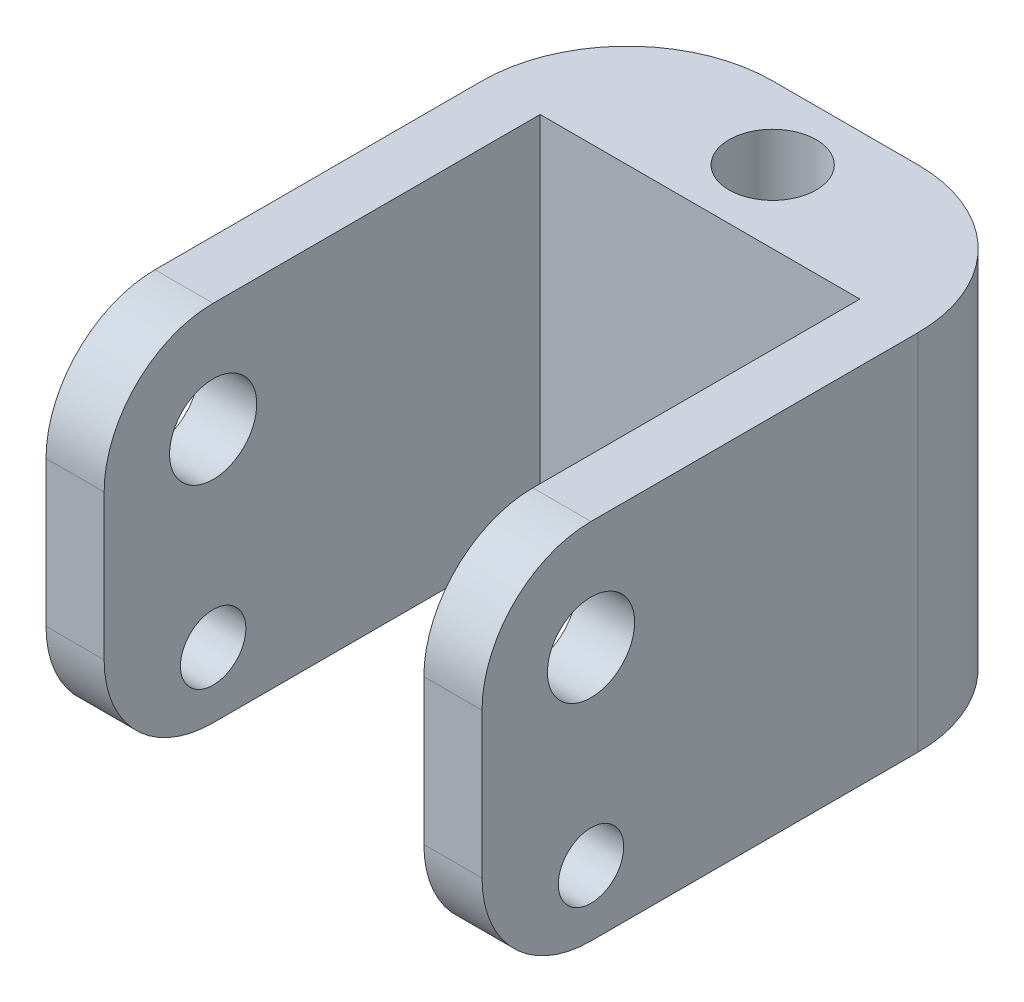
ISO-10303-21;
HEADER;
FILE_DESCRIPTION(('STEP AP214'),'2;1');
FILE_NAME('part.step','',(''),(''),'','','');
FILE_SCHEMA(('AUTOMOTIVE_DESIGN { 1 0 10303 214 1 1 1 1 }'));
ENDSEC;
DATA;
#1=APPLICATION_CONTEXT('core data for automotive mechanical design processes');
#2=APPLICATION_PROTOCOL_DEFINITION('international standard','automotive_design',2000,#1);
#3=PRODUCT_CONTEXT('',#1,'mechanical');
#4=PRODUCT('Part','Part','',(#3));
#5=PRODUCT_RELATED_PRODUCT_CATEGORY('part','',(#4));
#6=PRODUCT_DEFINITION_FORMATION('','',#4);
#7=PRODUCT_DEFINITION_CONTEXT('part definition',#1,'design');
#8=PRODUCT_DEFINITION('design','',#6,#7);
#9=PRODUCT_DEFINITION_SHAPE('','',#8);
#10=(LENGTH_UNIT() NAMED_UNIT(*) SI_UNIT(.MILLI.,.METRE.));
#11=(NAMED_UNIT(*) PLANE_ANGLE_UNIT() SI_UNIT($,.RADIAN.));
#12=(NAMED_UNIT(*) SI_UNIT($,.STERADIAN.) SOLID_ANGLE_UNIT());
#13=UNCERTAINTY_MEASURE_WITH_UNIT(LENGTH_MEASURE(1.E-05),#10,'distance_accuracy_value','');
#14=(GEOMETRIC_REPRESENTATION_CONTEXT(3) GLOBAL_UNCERTAINTY_ASSIGNED_CONTEXT((#13)) GLOBAL_UNIT_ASSIGNED_CONTEXT((#10,
#11,#12)) REPRESENTATION_CONTEXT('',''));
#15=CARTESIAN_POINT('',(0.,0.,0.));
#16=DIRECTION('',(0.,0.,1.));
#17=DIRECTION('',(1.,0.,0.));
#18=AXIS2_PLACEMENT_3D('',#15,#16,#17);
#19=CARTESIAN_POINT('',(30.,-25.,40.));
#20=DIRECTION('',(0.,0.,-1.));
#21=DIRECTION('',(-1.,0.,0.));
#22=AXIS2_PLACEMENT_3D('',#19,#20,#21);
#23=PLANE('',#22);
#24=DIRECTION('',(0.,1.,0.));
#25=VECTOR('',#24,1.);
#26=CARTESIAN_POINT('',(-22.,-25.,40.));
#27=LINE('',#26,#25);
#28=CARTESIAN_POINT('',(-22.,-10.,40.));
#29=VERTEX_POINT('',#28);
#30=CARTESIAN_POINT('',(-22.,10.,40.));
#31=VERTEX_POINT('',#30);
#32=EDGE_CURVE('E175',#29,#31,#27,.T.);
#33=ORIENTED_EDGE('',*,*,#32,.T.);
#34=DIRECTION('',(-1.,0.,0.));
#35=VECTOR('',#34,1.);
#36=CARTESIAN_POINT('',(30.,10.,40.));
#37=LINE('',#36,#35);
#38=CARTESIAN_POINT('',(-30.,10.,40.));
#39=VERTEX_POINT('',#38);
#40=EDGE_CURVE('E245',#31,#39,#37,.T.);
#41=ORIENTED_EDGE('',*,*,#40,.T.);
#42=DIRECTION('',(0.,-1.,0.));
#43=VECTOR('',#42,1.);
#44=CARTESIAN_POINT('',(-30.,-25.,40.));
#45=LINE('',#44,#43);
#46=CARTESIAN_POINT('',(-30.,-10.,40.));
#47=VERTEX_POINT('',#46);
#48=EDGE_CURVE('E210',#39,#47,#45,.T.);
#49=ORIENTED_EDGE('',*,*,#48,.T.);
#50=DIRECTION('',(-1.,0.,0.));
#51=VECTOR('',#50,1.);
#52=CARTESIAN_POINT('',(30.,-10.,40.));
#53=LINE('',#52,#51);
#54=EDGE_CURVE('E243',#47,#29,#53,.F.);
#55=ORIENTED_EDGE('',*,*,#54,.T.);
#56=EDGE_LOOP('',(#33,#41,#49,#55));
#57=FACE_BOUND('',#56,.T.);
#58=ADVANCED_FACE('F39',(#57),#23,.F.);
#59=CARTESIAN_POINT('',(30.,10.,25.));
#60=DIRECTION('',(-1.,0.,0.));
#61=DIRECTION('',(0.,0.,1.));
#62=AXIS2_PLACEMENT_3D('',#59,#60,#61);
#63=CYLINDRICAL_SURFACE('',#62,6.);
#64=CARTESIAN_POINT('',(-22.,10.,25.));
#65=DIRECTION('',(-1.,0.,0.));
#66=DIRECTION('',(0.,0.,1.));
#67=AXIS2_PLACEMENT_3D('',#64,#65,#66);
#68=CIRCLE('',#67,6.);
#69=CARTESIAN_POINT('',(-22.,10.,31.));
#70=VERTEX_POINT('',#69);
#71=EDGE_CURVE('E185',#70,#70,#68,.T.);
#72=ORIENTED_EDGE('',*,*,#71,.F.);
#73=EDGE_LOOP('',(#72));
#74=FACE_BOUND('',#73,.T.);
#75=CARTESIAN_POINT('',(-30.,10.,25.));
#76=DIRECTION('',(1.,0.,0.));
#77=DIRECTION('',(0.,0.,-1.));
#78=AXIS2_PLACEMENT_3D('',#75,#76,#77);
#79=CIRCLE('',#78,6.);
#80=CARTESIAN_POINT('',(-30.,10.,19.));
#81=VERTEX_POINT('',#80);
#82=EDGE_CURVE('E192',#81,#81,#79,.T.);
#83=ORIENTED_EDGE('',*,*,#82,.F.);
#84=EDGE_LOOP('',(#83));
#85=FACE_BOUND('',#84,.T.);
#86=ADVANCED_FACE('F296',(#74,#85),#63,.F.);
#87=CARTESIAN_POINT('',(30.,-16.,25.));
#88=DIRECTION('',(-1.,0.,0.));
#89=DIRECTION('',(0.,0.,1.));
#90=AXIS2_PLACEMENT_3D('',#87,#88,#89);
#91=CYLINDRICAL_SURFACE('',#90,4.5);
#92=CARTESIAN_POINT('',(-22.,-16.,25.));
#93=DIRECTION('',(-1.,0.,0.));
#94=DIRECTION('',(0.,0.,1.));
#95=AXIS2_PLACEMENT_3D('',#92,#93,#94);
#96=CIRCLE('',#95,4.5);
#97=CARTESIAN_POINT('',(-22.,-16.,29.5));
#98=VERTEX_POINT('',#97);
#99=EDGE_CURVE('E184',#98,#98,#96,.T.);
#100=ORIENTED_EDGE('',*,*,#99,.F.);
#101=EDGE_LOOP('',(#100));
#102=FACE_BOUND('',#101,.T.);
#103=CARTESIAN_POINT('',(-30.,-16.,25.));
#104=DIRECTION('',(1.,0.,0.));
#105=DIRECTION('',(0.,0.,-1.));
#106=AXIS2_PLACEMENT_3D('',#103,#104,#105);
#107=CIRCLE('',#106,4.5);
#108=CARTESIAN_POINT('',(-30.,-16.,20.5));
#109=VERTEX_POINT('',#108);
#110=EDGE_CURVE('E188',#109,#109,#107,.T.);
#111=ORIENTED_EDGE('',*,*,#110,.F.);
#112=EDGE_LOOP('',(#111));
#113=FACE_BOUND('',#112,.T.);
#114=ADVANCED_FACE('F304',(#102,#113),#91,.F.);
#115=CARTESIAN_POINT('',(30.,0.,0.));
#116=DIRECTION('',(-1.,0.,0.));
#117=DIRECTION('',(0.,0.,1.));
#118=AXIS2_PLACEMENT_3D('',#115,#116,#117);
#119=PLANE('',#118);
#120=DIRECTION('',(0.,-1.,0.));
#121=VECTOR('',#120,1.);
#122=CARTESIAN_POINT('',(30.,-25.,40.));
#123=LINE('',#122,#121);
#124=CARTESIAN_POINT('',(30.,10.,40.));
#125=VERTEX_POINT('',#124);
#126=CARTESIAN_POINT('',(30.,-10.,40.));
#127=VERTEX_POINT('',#126);
#128=EDGE_CURVE('E203',#125,#127,#123,.T.);
#129=ORIENTED_EDGE('',*,*,#128,.T.);
#130=CARTESIAN_POINT('',(30.,-10.,25.));
#131=DIRECTION('',(-1.,0.,0.));
#132=DIRECTION('',(0.,0.,1.));
#133=AXIS2_PLACEMENT_3D('',#130,#131,#132);
#134=CIRCLE('',#133,15.);
#135=CARTESIAN_POINT('',(30.,-25.,25.));
#136=VERTEX_POINT('',#135);
#137=EDGE_CURVE('E11',#127,#136,#134,.F.);
#138=ORIENTED_EDGE('',*,*,#137,.T.);
#139=DIRECTION('',(0.,0.,-1.));
#140=VECTOR('',#139,1.);
#141=CARTESIAN_POINT('',(30.,-25.,40.));
#142=LINE('',#141,#140);
#143=CARTESIAN_POINT('',(30.,-25.,-20.));
#144=VERTEX_POINT('',#143);
#145=EDGE_CURVE('E206',#136,#144,#142,.T.);
#146=ORIENTED_EDGE('',*,*,#145,.T.);
#147=DIRECTION('',(0.,1.,0.));
#148=VECTOR('',#147,1.);
#149=CARTESIAN_POINT('',(30.,0.,-20.));
#150=LINE('',#149,#148);
#151=CARTESIAN_POINT('',(30.,25.,-20.));
#152=VERTEX_POINT('',#151);
#153=EDGE_CURVE('E240',#144,#152,#150,.T.);
#154=ORIENTED_EDGE('',*,*,#153,.T.);
#155=DIRECTION('',(0.,0.,1.));
#156=VECTOR('',#155,1.);
#157=CARTESIAN_POINT('',(30.,25.,40.));
#158=LINE('',#157,#156);
#159=CARTESIAN_POINT('',(30.,25.,25.));
#160=VERTEX_POINT('',#159);
#161=EDGE_CURVE('E201',#152,#160,#158,.T.);
#162=ORIENTED_EDGE('',*,*,#161,.T.);
#163=CARTESIAN_POINT('',(30.,10.,25.));
#164=DIRECTION('',(-1.,0.,0.));
#165=DIRECTION('',(0.,0.,1.));
#166=AXIS2_PLACEMENT_3D('',#163,#164,#165);
#167=CIRCLE('',#166,15.);
#168=EDGE_CURVE('E47',#160,#125,#167,.F.);
#169=ORIENTED_EDGE('',*,*,#168,.T.);
#170=EDGE_LOOP('',(#129,#138,#146,#154,#162,#169));
#171=FACE_BOUND('',#170,.T.);
#172=CARTESIAN_POINT('',(30.,10.,25.));
#173=DIRECTION('',(1.,0.,0.));
#174=DIRECTION('',(0.,0.,-1.));
#175=AXIS2_PLACEMENT_3D('',#172,#173,#174);
#176=CIRCLE('',#175,6.);
#177=CARTESIAN_POINT('',(30.,10.,19.));
#178=VERTEX_POINT('',#177);
#179=EDGE_CURVE('E195',#178,#178,#176,.T.);
#180=ORIENTED_EDGE('',*,*,#179,.F.);
#181=EDGE_LOOP('',(#180));
#182=FACE_BOUND('',#181,.T.);
#183=CARTESIAN_POINT('',(30.,-16.,25.));
#184=DIRECTION('',(1.,0.,0.));
#185=DIRECTION('',(0.,0.,-1.));
#186=AXIS2_PLACEMENT_3D('',#183,#184,#185);
#187=CIRCLE('',#186,4.5);
#188=CARTESIAN_POINT('',(30.,-16.,20.5));
#189=VERTEX_POINT('',#188);
#190=EDGE_CURVE('E189',#189,#189,#187,.T.);
#191=ORIENTED_EDGE('',*,*,#190,.F.);
#192=EDGE_LOOP('',(#191));
#193=FACE_BOUND('',#192,.T.);
#194=ADVANCED_FACE('F285',(#171,#182,#193),#119,.F.);
#195=CARTESIAN_POINT('',(-30.,0.,0.));
#196=DIRECTION('',(-1.,0.,0.));
#197=DIRECTION('',(0.,0.,1.));
#198=AXIS2_PLACEMENT_3D('',#195,#196,#197);
#199=PLANE('',#198);
#200=ORIENTED_EDGE('',*,*,#82,.T.);
#201=EDGE_LOOP('',(#200));
#202=FACE_BOUND('',#201,.T.);
#203=ORIENTED_EDGE('',*,*,#48,.F.);
#204=CARTESIAN_POINT('',(-30.,10.,25.));
#205=DIRECTION('',(-1.,0.,0.));
#206=DIRECTION('',(0.,0.,1.));
#207=AXIS2_PLACEMENT_3D('',#204,#205,#206);
#208=CIRCLE('',#207,15.);
#209=CARTESIAN_POINT('',(-30.,25.,25.));
#210=VERTEX_POINT('',#209);
#211=EDGE_CURVE('E250',#39,#210,#208,.T.);
#212=ORIENTED_EDGE('',*,*,#211,.T.);
#213=DIRECTION('',(0.,0.,1.));
#214=VECTOR('',#213,1.);
#215=CARTESIAN_POINT('',(-30.,25.,40.));
#216=LINE('',#215,#214);
#217=CARTESIAN_POINT('',(-30.,25.,-20.));
#218=VERTEX_POINT('',#217);
#219=EDGE_CURVE('E198',#218,#210,#216,.T.);
#220=ORIENTED_EDGE('',*,*,#219,.F.);
#221=DIRECTION('',(0.,1.,0.));
#222=VECTOR('',#221,1.);
#223=CARTESIAN_POINT('',(-30.,-25.,-20.));
#224=LINE('',#223,#222);
#225=CARTESIAN_POINT('',(-30.,-25.,-20.));
#226=VERTEX_POINT('',#225);
#227=EDGE_CURVE('E232',#218,#226,#224,.F.);
#228=ORIENTED_EDGE('',*,*,#227,.T.);
#229=DIRECTION('',(0.,0.,-1.));
#230=VECTOR('',#229,1.);
#231=CARTESIAN_POINT('',(-30.,-25.,40.));
#232=LINE('',#231,#230);
#233=CARTESIAN_POINT('',(-30.,-25.,25.));
#234=VERTEX_POINT('',#233);
#235=EDGE_CURVE('E204',#234,#226,#232,.T.);
#236=ORIENTED_EDGE('',*,*,#235,.F.);
#237=CARTESIAN_POINT('',(-30.,-10.,25.));
#238=DIRECTION('',(-1.,0.,0.));
#239=DIRECTION('',(0.,0.,1.));
#240=AXIS2_PLACEMENT_3D('',#237,#238,#239);
#241=CIRCLE('',#240,15.);
#242=EDGE_CURVE('E248',#234,#47,#241,.T.);
#243=ORIENTED_EDGE('',*,*,#242,.T.);
#244=EDGE_LOOP('',(#203,#212,#220,#228,#236,#243));
#245=FACE_BOUND('',#244,.T.);
#246=ORIENTED_EDGE('',*,*,#110,.T.);
#247=EDGE_LOOP('',(#246));
#248=FACE_BOUND('',#247,.T.);
#249=ADVANCED_FACE('F322',(#202,#245,#248),#199,.T.);
#250=CARTESIAN_POINT('',(30.,-25.,-40.));
#251=DIRECTION('',(0.,0.,1.));
#252=DIRECTION('',(1.,0.,0.));
#253=AXIS2_PLACEMENT_3D('',#250,#251,#252);
#254=PLANE('',#253);
#255=DIRECTION('',(-1.,0.,0.));
#256=VECTOR('',#255,1.);
#257=CARTESIAN_POINT('',(30.,-25.,-40.));
#258=LINE('',#257,#256);
#259=CARTESIAN_POINT('',(10.,-25.,-40.));
#260=VERTEX_POINT('',#259);
#261=CARTESIAN_POINT('',(-9.99999999999999,-25.,-40.));
#262=VERTEX_POINT('',#261);
#263=EDGE_CURVE('E208',#260,#262,#258,.T.);
#264=ORIENTED_EDGE('',*,*,#263,.T.);
#265=DIRECTION('',(0.,1.,0.));
#266=VECTOR('',#265,1.);
#267=CARTESIAN_POINT('',(-9.99999999999999,25.,-40.));
#268=LINE('',#267,#266);
#269=CARTESIAN_POINT('',(-9.99999999999999,25.,-40.));
#270=VERTEX_POINT('',#269);
#271=EDGE_CURVE('E225',#262,#270,#268,.T.);
#272=ORIENTED_EDGE('',*,*,#271,.T.);
#273=DIRECTION('',(-1.,0.,0.));
#274=VECTOR('',#273,1.);
#275=CARTESIAN_POINT('',(30.,25.,-40.));
#276=LINE('',#275,#274);
#277=CARTESIAN_POINT('',(10.,25.,-40.));
#278=VERTEX_POINT('',#277);
#279=EDGE_CURVE('E216',#278,#270,#276,.T.);
#280=ORIENTED_EDGE('',*,*,#279,.F.);
#281=DIRECTION('',(0.,1.,0.));
#282=VECTOR('',#281,1.);
#283=CARTESIAN_POINT('',(10.,-25.,-40.));
#284=LINE('',#283,#282);
#285=EDGE_CURVE('E219',#278,#260,#284,.F.);
#286=ORIENTED_EDGE('',*,*,#285,.T.);
#287=EDGE_LOOP('',(#264,#272,#280,#286));
#288=FACE_BOUND('',#287,.T.);
#289=ADVANCED_FACE('F316',(#288),#254,.F.);
#290=CARTESIAN_POINT('',(30.,25.,40.));
#291=DIRECTION('',(0.,-1.,0.));
#292=DIRECTION('',(0.,0.,-1.));
#293=AXIS2_PLACEMENT_3D('',#290,#291,#292);
#294=PLANE('',#293);
#295=CARTESIAN_POINT('',(0.,25.,-30.));
#296=DIRECTION('',(0.,1.,0.));
#297=DIRECTION('',(0.,0.,1.));
#298=AXIS2_PLACEMENT_3D('',#295,#296,#297);
#299=CIRCLE('',#298,6.);
#300=CARTESIAN_POINT('',(0.,25.,-24.));
#301=VERTEX_POINT('',#300);
#302=EDGE_CURVE('E363',#301,#301,#299,.T.);
#303=ORIENTED_EDGE('',*,*,#302,.F.);
#304=EDGE_LOOP('',(#303));
#305=FACE_BOUND('',#304,.T.);
#306=ORIENTED_EDGE('',*,*,#219,.T.);
#307=DIRECTION('',(-1.,0.,0.));
#308=VECTOR('',#307,1.);
#309=CARTESIAN_POINT('',(30.,25.,25.));
#310=LINE('',#309,#308);
#311=CARTESIAN_POINT('',(-22.,25.,25.));
#312=VERTEX_POINT('',#311);
#313=EDGE_CURVE('E254',#210,#312,#310,.F.);
#314=ORIENTED_EDGE('',*,*,#313,.T.);
#315=DIRECTION('',(0.,0.,1.));
#316=VECTOR('',#315,1.);
#317=CARTESIAN_POINT('',(-22.,25.,40.));
#318=LINE('',#317,#316);
#319=CARTESIAN_POINT('',(-22.,25.,-20.));
#320=VERTEX_POINT('',#319);
#321=EDGE_CURVE('E151',#320,#312,#318,.T.);
#322=ORIENTED_EDGE('',*,*,#321,.F.);
#323=DIRECTION('',(-1.,0.,0.));
#324=VECTOR('',#323,1.);
#325=CARTESIAN_POINT('',(-22.,25.,-20.));
#326=LINE('',#325,#324);
#327=CARTESIAN_POINT('',(22.,25.,-20.));
#328=VERTEX_POINT('',#327);
#329=EDGE_CURVE('E150',#328,#320,#326,.T.);
#330=ORIENTED_EDGE('',*,*,#329,.F.);
#331=DIRECTION('',(0.,0.,-1.));
#332=VECTOR('',#331,1.);
#333=CARTESIAN_POINT('',(22.,25.,40.));
#334=LINE('',#333,#332);
#335=CARTESIAN_POINT('',(22.,25.,25.));
#336=VERTEX_POINT('',#335);
#337=EDGE_CURVE('E140',#336,#328,#334,.T.);
#338=ORIENTED_EDGE('',*,*,#337,.F.);
#339=DIRECTION('',(-1.,0.,0.));
#340=VECTOR('',#339,1.);
#341=CARTESIAN_POINT('',(30.,25.,25.));
#342=LINE('',#341,#340);
#343=EDGE_CURVE('E252',#336,#160,#342,.F.);
#344=ORIENTED_EDGE('',*,*,#343,.T.);
#345=ORIENTED_EDGE('',*,*,#161,.F.);
#346=CARTESIAN_POINT('',(10.,25.,-20.));
#347=DIRECTION('',(0.,-1.,0.));
#348=DIRECTION('',(0.,0.,-1.));
#349=AXIS2_PLACEMENT_3D('',#346,#347,#348);
#350=CIRCLE('',#349,20.);
#351=EDGE_CURVE('E228',#152,#278,#350,.F.);
#352=ORIENTED_EDGE('',*,*,#351,.T.);
#353=ORIENTED_EDGE('',*,*,#279,.T.);
#354=CARTESIAN_POINT('',(-9.99999999999999,25.,-20.));
#355=DIRECTION('',(0.,-1.,0.));
#356=DIRECTION('',(0.,0.,-1.));
#357=AXIS2_PLACEMENT_3D('',#354,#355,#356);
#358=CIRCLE('',#357,20.);
#359=EDGE_CURVE('E230',#270,#218,#358,.F.);
#360=ORIENTED_EDGE('',*,*,#359,.T.);
#361=EDGE_LOOP('',(#306,#314,#322,#330,#338,#344,#345,#352,#353,#360));
#362=FACE_BOUND('',#361,.T.);
#363=ADVANCED_FACE('F164',(#305,#362),#294,.F.);
#364=DIRECTION('',(0.,1.,0.));
#365=VECTOR('',#364,1.);
#366=CARTESIAN_POINT('',(22.,-25.,40.));
#367=LINE('',#366,#365);
#368=CARTESIAN_POINT('',(22.,-10.,40.));
#369=VERTEX_POINT('',#368);
#370=CARTESIAN_POINT('',(22.,10.,40.));
#371=VERTEX_POINT('',#370);
#372=EDGE_CURVE('E161',#369,#371,#367,.T.);
#373=ORIENTED_EDGE('',*,*,#372,.F.);
#374=DIRECTION('',(-1.,0.,0.));
#375=VECTOR('',#374,1.);
#376=CARTESIAN_POINT('',(30.,-10.,40.));
#377=LINE('',#376,#375);
#378=EDGE_CURVE('E54',#369,#127,#377,.F.);
#379=ORIENTED_EDGE('',*,*,#378,.T.);
#380=ORIENTED_EDGE('',*,*,#128,.F.);
#381=DIRECTION('',(-1.,0.,0.));
#382=VECTOR('',#381,1.);
#383=CARTESIAN_POINT('',(30.,10.,40.));
#384=LINE('',#383,#382);
#385=EDGE_CURVE('E269',#125,#371,#384,.T.);
#386=ORIENTED_EDGE('',*,*,#385,.T.);
#387=EDGE_LOOP('',(#373,#379,#380,#386));
#388=FACE_BOUND('',#387,.T.);
#389=ADVANCED_FACE('F273',(#388),#23,.F.);
#390=CARTESIAN_POINT('',(30.,-25.,40.));
#391=DIRECTION('',(0.,1.,0.));
#392=DIRECTION('',(0.,0.,1.));
#393=AXIS2_PLACEMENT_3D('',#390,#391,#392);
#394=PLANE('',#393);
#395=CARTESIAN_POINT('',(0.,-25.,-30.));
#396=DIRECTION('',(0.,1.,0.));
#397=DIRECTION('',(0.,0.,1.));
#398=AXIS2_PLACEMENT_3D('',#395,#396,#397);
#399=CIRCLE('',#398,6.);
#400=CARTESIAN_POINT('',(0.,-25.,-24.));
#401=VERTEX_POINT('',#400);
#402=EDGE_CURVE('E361',#401,#401,#399,.T.);
#403=ORIENTED_EDGE('',*,*,#402,.T.);
#404=EDGE_LOOP('',(#403));
#405=FACE_BOUND('',#404,.T.);
#406=DIRECTION('',(0.,0.,1.));
#407=VECTOR('',#406,1.);
#408=CARTESIAN_POINT('',(-22.,-25.,40.));
#409=LINE('',#408,#407);
#410=CARTESIAN_POINT('',(-22.,-25.,-20.));
#411=VERTEX_POINT('',#410);
#412=CARTESIAN_POINT('',(-22.,-25.,25.));
#413=VERTEX_POINT('',#412);
#414=EDGE_CURVE('E166',#411,#413,#409,.T.);
#415=ORIENTED_EDGE('',*,*,#414,.T.);
#416=DIRECTION('',(-1.,0.,0.));
#417=VECTOR('',#416,1.);
#418=CARTESIAN_POINT('',(30.,-25.,25.));
#419=LINE('',#418,#417);
#420=EDGE_CURVE('E263',#413,#234,#419,.T.);
#421=ORIENTED_EDGE('',*,*,#420,.T.);
#422=ORIENTED_EDGE('',*,*,#235,.T.);
#423=CARTESIAN_POINT('',(-9.99999999999999,-25.,-20.));
#424=DIRECTION('',(0.,1.,0.));
#425=DIRECTION('',(0.,0.,1.));
#426=AXIS2_PLACEMENT_3D('',#423,#424,#425);
#427=CIRCLE('',#426,20.);
#428=EDGE_CURVE('E238',#226,#262,#427,.F.);
#429=ORIENTED_EDGE('',*,*,#428,.T.);
#430=ORIENTED_EDGE('',*,*,#263,.F.);
#431=CARTESIAN_POINT('',(10.,-25.,-20.));
#432=DIRECTION('',(0.,1.,0.));
#433=DIRECTION('',(0.,0.,1.));
#434=AXIS2_PLACEMENT_3D('',#431,#432,#433);
#435=CIRCLE('',#434,20.);
#436=EDGE_CURVE('E235',#260,#144,#435,.F.);
#437=ORIENTED_EDGE('',*,*,#436,.T.);
#438=ORIENTED_EDGE('',*,*,#145,.F.);
#439=DIRECTION('',(-1.,0.,0.));
#440=VECTOR('',#439,1.);
#441=CARTESIAN_POINT('',(30.,-25.,25.));
#442=LINE('',#441,#440);
#443=CARTESIAN_POINT('',(22.,-25.,25.));
#444=VERTEX_POINT('',#443);
#445=EDGE_CURVE('E260',#136,#444,#442,.T.);
#446=ORIENTED_EDGE('',*,*,#445,.T.);
#447=DIRECTION('',(0.,0.,-1.));
#448=VECTOR('',#447,1.);
#449=CARTESIAN_POINT('',(22.,-25.,40.));
#450=LINE('',#449,#448);
#451=CARTESIAN_POINT('',(22.,-25.,-20.));
#452=VERTEX_POINT('',#451);
#453=EDGE_CURVE('E169',#444,#452,#450,.T.);
#454=ORIENTED_EDGE('',*,*,#453,.T.);
#455=DIRECTION('',(-1.,0.,0.));
#456=VECTOR('',#455,1.);
#457=CARTESIAN_POINT('',(-22.,-25.,-20.));
#458=LINE('',#457,#456);
#459=EDGE_CURVE('E159',#452,#411,#458,.T.);
#460=ORIENTED_EDGE('',*,*,#459,.T.);
#461=EDGE_LOOP('',(#415,#421,#422,#429,#430,#437,#438,#446,#454,#460));
#462=FACE_BOUND('',#461,.T.);
#463=ADVANCED_FACE('F281',(#405,#462),#394,.F.);
#464=CARTESIAN_POINT('',(22.,10.,25.));
#465=DIRECTION('',(1.,0.,0.));
#466=DIRECTION('',(0.,0.,-1.));
#467=AXIS2_PLACEMENT_3D('',#464,#465,#466);
#468=CIRCLE('',#467,6.);
#469=CARTESIAN_POINT('',(22.,10.,19.));
#470=VERTEX_POINT('',#469);
#471=EDGE_CURVE('E181',#470,#470,#468,.T.);
#472=ORIENTED_EDGE('',*,*,#471,.F.);
#473=EDGE_LOOP('',(#472));
#474=FACE_BOUND('',#473,.T.);
#475=ORIENTED_EDGE('',*,*,#179,.T.);
#476=EDGE_LOOP('',(#475));
#477=FACE_BOUND('',#476,.T.);
#478=ADVANCED_FACE('F307',(#474,#477),#63,.F.);
#479=CARTESIAN_POINT('',(22.,-16.,25.));
#480=DIRECTION('',(1.,0.,0.));
#481=DIRECTION('',(0.,0.,-1.));
#482=AXIS2_PLACEMENT_3D('',#479,#480,#481);
#483=CIRCLE('',#482,4.5);
#484=CARTESIAN_POINT('',(22.,-16.,20.5));
#485=VERTEX_POINT('',#484);
#486=EDGE_CURVE('E176',#485,#485,#483,.T.);
#487=ORIENTED_EDGE('',*,*,#486,.F.);
#488=EDGE_LOOP('',(#487));
#489=FACE_BOUND('',#488,.T.);
#490=ORIENTED_EDGE('',*,*,#190,.T.);
#491=EDGE_LOOP('',(#490));
#492=FACE_BOUND('',#491,.T.);
#493=ADVANCED_FACE('F382',(#489,#492),#91,.F.);
#494=CARTESIAN_POINT('',(-22.,-25.,40.));
#495=DIRECTION('',(-1.,0.,0.));
#496=DIRECTION('',(0.,0.,1.));
#497=AXIS2_PLACEMENT_3D('',#494,#495,#496);
#498=PLANE('',#497);
#499=ORIENTED_EDGE('',*,*,#71,.T.);
#500=EDGE_LOOP('',(#499));
#501=FACE_BOUND('',#500,.T.);
#502=ORIENTED_EDGE('',*,*,#99,.T.);
#503=EDGE_LOOP('',(#502));
#504=FACE_BOUND('',#503,.T.);
#505=ORIENTED_EDGE('',*,*,#321,.T.);
#506=CARTESIAN_POINT('',(-22.,10.,25.));
#507=DIRECTION('',(-1.,0.,0.));
#508=DIRECTION('',(0.,0.,1.));
#509=AXIS2_PLACEMENT_3D('',#506,#507,#508);
#510=CIRCLE('',#509,15.);
#511=EDGE_CURVE('E258',#312,#31,#510,.F.);
#512=ORIENTED_EDGE('',*,*,#511,.T.);
#513=ORIENTED_EDGE('',*,*,#32,.F.);
#514=CARTESIAN_POINT('',(-22.,-10.,25.));
#515=DIRECTION('',(-1.,0.,0.));
#516=DIRECTION('',(0.,0.,1.));
#517=AXIS2_PLACEMENT_3D('',#514,#515,#516);
#518=CIRCLE('',#517,15.);
#519=EDGE_CURVE('E256',#29,#413,#518,.F.);
#520=ORIENTED_EDGE('',*,*,#519,.T.);
#521=ORIENTED_EDGE('',*,*,#414,.F.);
#522=DIRECTION('',(0.,1.,0.));
#523=VECTOR('',#522,1.);
#524=CARTESIAN_POINT('',(-22.,-25.,-20.));
#525=LINE('',#524,#523);
#526=EDGE_CURVE('E160',#411,#320,#525,.T.);
#527=ORIENTED_EDGE('',*,*,#526,.T.);
#528=EDGE_LOOP('',(#505,#512,#513,#520,#521,#527));
#529=FACE_BOUND('',#528,.T.);
#530=ADVANCED_FACE('F348',(#501,#504,#529),#498,.F.);
#531=CARTESIAN_POINT('',(-22.,-25.,-20.));
#532=DIRECTION('',(0.,0.,-1.));
#533=DIRECTION('',(-1.,0.,0.));
#534=AXIS2_PLACEMENT_3D('',#531,#532,#533);
#535=PLANE('',#534);
#536=ORIENTED_EDGE('',*,*,#526,.F.);
#537=ORIENTED_EDGE('',*,*,#459,.F.);
#538=DIRECTION('',(0.,1.,0.));
#539=VECTOR('',#538,1.);
#540=CARTESIAN_POINT('',(22.,-25.,-20.));
#541=LINE('',#540,#539);
#542=EDGE_CURVE('E144',#452,#328,#541,.T.);
#543=ORIENTED_EDGE('',*,*,#542,.T.);
#544=ORIENTED_EDGE('',*,*,#329,.T.);
#545=EDGE_LOOP('',(#536,#537,#543,#544));
#546=FACE_BOUND('',#545,.T.);
#547=ADVANCED_FACE('F156',(#546),#535,.F.);
#548=CARTESIAN_POINT('',(22.,-25.,40.));
#549=DIRECTION('',(1.,0.,0.));
#550=DIRECTION('',(0.,0.,-1.));
#551=AXIS2_PLACEMENT_3D('',#548,#549,#550);
#552=PLANE('',#551);
#553=ORIENTED_EDGE('',*,*,#471,.T.);
#554=EDGE_LOOP('',(#553));
#555=FACE_BOUND('',#554,.T.);
#556=ORIENTED_EDGE('',*,*,#486,.T.);
#557=EDGE_LOOP('',(#556));
#558=FACE_BOUND('',#557,.T.);
#559=ORIENTED_EDGE('',*,*,#453,.F.);
#560=CARTESIAN_POINT('',(22.,-10.,25.));
#561=DIRECTION('',(1.,0.,0.));
#562=DIRECTION('',(0.,0.,-1.));
#563=AXIS2_PLACEMENT_3D('',#560,#561,#562);
#564=CIRCLE('',#563,15.);
#565=EDGE_CURVE('E267',#444,#369,#564,.F.);
#566=ORIENTED_EDGE('',*,*,#565,.T.);
#567=ORIENTED_EDGE('',*,*,#372,.T.);
#568=CARTESIAN_POINT('',(22.,10.,25.));
#569=DIRECTION('',(1.,0.,0.));
#570=DIRECTION('',(0.,0.,-1.));
#571=AXIS2_PLACEMENT_3D('',#568,#569,#570);
#572=CIRCLE('',#571,15.);
#573=EDGE_CURVE('E146',#371,#336,#572,.F.);
#574=ORIENTED_EDGE('',*,*,#573,.T.);
#575=ORIENTED_EDGE('',*,*,#337,.T.);
#576=ORIENTED_EDGE('',*,*,#542,.F.);
#577=EDGE_LOOP('',(#559,#566,#567,#574,#575,#576));
#578=FACE_BOUND('',#577,.T.);
#579=ADVANCED_FACE('F143',(#555,#558,#578),#552,.F.);
#580=CARTESIAN_POINT('',(0.,-25.,-30.));
#581=DIRECTION('',(0.,1.,0.));
#582=DIRECTION('',(0.,0.,1.));
#583=AXIS2_PLACEMENT_3D('',#580,#581,#582);
#584=CYLINDRICAL_SURFACE('',#583,6.);
#585=ORIENTED_EDGE('',*,*,#402,.F.);
#586=EDGE_LOOP('',(#585));
#587=FACE_BOUND('',#586,.T.);
#588=ORIENTED_EDGE('',*,*,#302,.T.);
#589=EDGE_LOOP('',(#588));
#590=FACE_BOUND('',#589,.T.);
#591=ADVANCED_FACE('F331',(#587,#590),#584,.F.);
#592=CARTESIAN_POINT('',(-9.99999999999999,-25.,-20.));
#593=DIRECTION('',(0.,-1.,0.));
#594=DIRECTION('',(0.,0.,-1.));
#595=AXIS2_PLACEMENT_3D('',#592,#593,#594);
#596=CYLINDRICAL_SURFACE('',#595,20.);
#597=ORIENTED_EDGE('',*,*,#428,.F.);
#598=ORIENTED_EDGE('',*,*,#227,.F.);
#599=ORIENTED_EDGE('',*,*,#359,.F.);
#600=ORIENTED_EDGE('',*,*,#271,.F.);
#601=EDGE_LOOP('',(#597,#598,#599,#600));
#602=FACE_BOUND('',#601,.T.);
#603=ADVANCED_FACE('F327',(#602),#596,.T.);
#604=CARTESIAN_POINT('',(10.,0.,-20.));
#605=DIRECTION('',(0.,1.,0.));
#606=DIRECTION('',(0.,0.,1.));
#607=AXIS2_PLACEMENT_3D('',#604,#605,#606);
#608=CYLINDRICAL_SURFACE('',#607,20.);
#609=ORIENTED_EDGE('',*,*,#436,.F.);
#610=ORIENTED_EDGE('',*,*,#285,.F.);
#611=ORIENTED_EDGE('',*,*,#351,.F.);
#612=ORIENTED_EDGE('',*,*,#153,.F.);
#613=EDGE_LOOP('',(#609,#610,#611,#612));
#614=FACE_BOUND('',#613,.T.);
#615=ADVANCED_FACE('F330',(#614),#608,.T.);
#616=CARTESIAN_POINT('',(30.,10.,25.));
#617=DIRECTION('',(-1.,0.,0.));
#618=DIRECTION('',(0.,0.,1.));
#619=AXIS2_PLACEMENT_3D('',#616,#617,#618);
#620=CYLINDRICAL_SURFACE('',#619,15.);
#621=ORIENTED_EDGE('',*,*,#511,.F.);
#622=ORIENTED_EDGE('',*,*,#313,.F.);
#623=ORIENTED_EDGE('',*,*,#211,.F.);
#624=ORIENTED_EDGE('',*,*,#40,.F.);
#625=EDGE_LOOP('',(#621,#622,#623,#624));
#626=FACE_BOUND('',#625,.T.);
#627=ADVANCED_FACE('F334',(#626),#620,.T.);
#628=CARTESIAN_POINT('',(30.,-10.,25.));
#629=DIRECTION('',(-1.,0.,0.));
#630=DIRECTION('',(0.,0.,1.));
#631=AXIS2_PLACEMENT_3D('',#628,#629,#630);
#632=CYLINDRICAL_SURFACE('',#631,15.);
#633=ORIENTED_EDGE('',*,*,#519,.F.);
#634=ORIENTED_EDGE('',*,*,#54,.F.);
#635=ORIENTED_EDGE('',*,*,#242,.F.);
#636=ORIENTED_EDGE('',*,*,#420,.F.);
#637=EDGE_LOOP('',(#633,#634,#635,#636));
#638=FACE_BOUND('',#637,.T.);
#639=ADVANCED_FACE('F294',(#638),#632,.T.);
#640=CARTESIAN_POINT('',(30.,-10.,25.));
#641=DIRECTION('',(-1.,0.,0.));
#642=DIRECTION('',(0.,0.,1.));
#643=AXIS2_PLACEMENT_3D('',#640,#641,#642);
#644=CYLINDRICAL_SURFACE('',#643,15.);
#645=ORIENTED_EDGE('',*,*,#137,.F.);
#646=ORIENTED_EDGE('',*,*,#378,.F.);
#647=ORIENTED_EDGE('',*,*,#565,.F.);
#648=ORIENTED_EDGE('',*,*,#445,.F.);
#649=EDGE_LOOP('',(#645,#646,#647,#648));
#650=FACE_BOUND('',#649,.T.);
#651=ADVANCED_FACE('F278',(#650),#644,.T.);
#652=CARTESIAN_POINT('',(30.,10.,25.));
#653=DIRECTION('',(-1.,0.,0.));
#654=DIRECTION('',(0.,0.,1.));
#655=AXIS2_PLACEMENT_3D('',#652,#653,#654);
#656=CYLINDRICAL_SURFACE('',#655,15.);
#657=ORIENTED_EDGE('',*,*,#168,.F.);
#658=ORIENTED_EDGE('',*,*,#343,.F.);
#659=ORIENTED_EDGE('',*,*,#573,.F.);
#660=ORIENTED_EDGE('',*,*,#385,.F.);
#661=EDGE_LOOP('',(#657,#658,#659,#660));
#662=FACE_BOUND('',#661,.T.);
#663=ADVANCED_FACE('F41',(#662),#656,.T.);
#664=CLOSED_SHELL('',(#58,#86,#114,#194,#249,#289,#363,#389,#463,#478,#493,#530,#547,#579,#591,
#603,#615,#627,#639,#651,#663));
#665=MANIFOLD_SOLID_BREP('B2',#664);
#666=ADVANCED_BREP_SHAPE_REPRESENTATION('',(#18,#665),#14);
#667=SHAPE_DEFINITION_REPRESENTATION(#9,#666);
ENDSEC;
END-ISO-10303-21;
